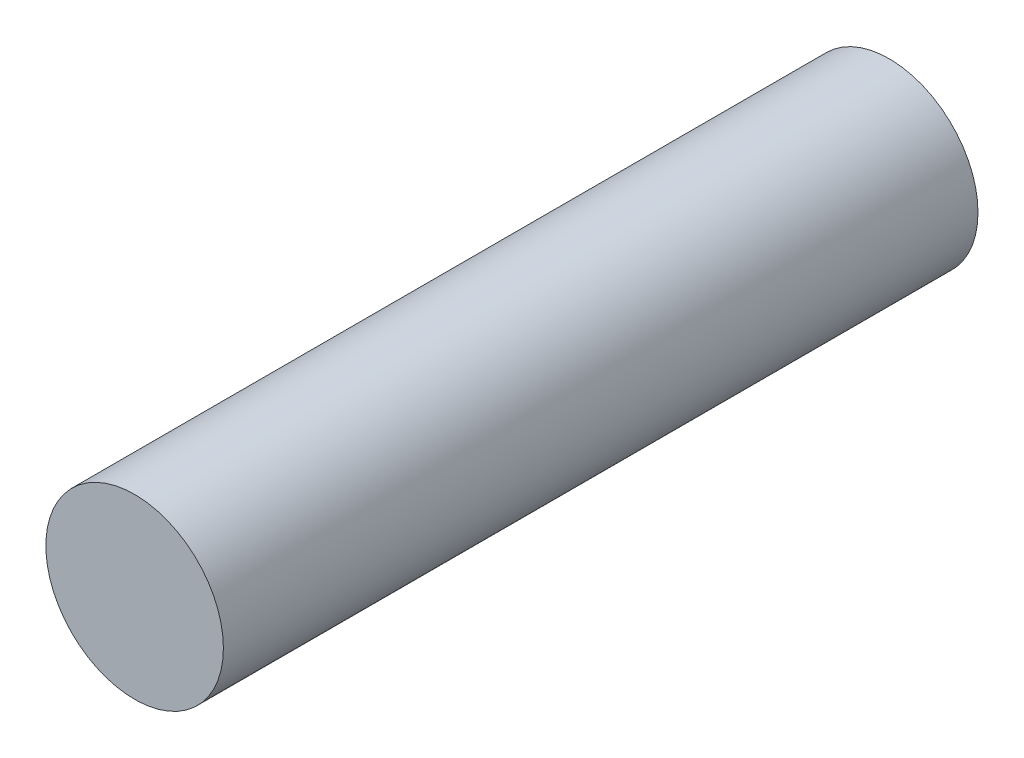
ISO-10303-21;
HEADER;
FILE_DESCRIPTION(('STEP AP214'),'2;1');
FILE_NAME('part.step','',(''),(''),'','','');
FILE_SCHEMA(('AUTOMOTIVE_DESIGN { 1 0 10303 214 1 1 1 1 }'));
ENDSEC;
DATA;
#1=APPLICATION_CONTEXT('core data for automotive mechanical design processes');
#2=APPLICATION_PROTOCOL_DEFINITION('international standard','automotive_design',2000,#1);
#3=PRODUCT_CONTEXT('',#1,'mechanical');
#4=PRODUCT('Part','Part','',(#3));
#5=PRODUCT_RELATED_PRODUCT_CATEGORY('part','',(#4));
#6=PRODUCT_DEFINITION_FORMATION('','',#4);
#7=PRODUCT_DEFINITION_CONTEXT('part definition',#1,'design');
#8=PRODUCT_DEFINITION('design','',#6,#7);
#9=PRODUCT_DEFINITION_SHAPE('','',#8);
#10=(LENGTH_UNIT() NAMED_UNIT(*) SI_UNIT(.MILLI.,.METRE.));
#11=(NAMED_UNIT(*) PLANE_ANGLE_UNIT() SI_UNIT($,.RADIAN.));
#12=(NAMED_UNIT(*) SI_UNIT($,.STERADIAN.) SOLID_ANGLE_UNIT());
#13=UNCERTAINTY_MEASURE_WITH_UNIT(LENGTH_MEASURE(1.E-05),#10,'distance_accuracy_value','');
#14=(GEOMETRIC_REPRESENTATION_CONTEXT(3) GLOBAL_UNCERTAINTY_ASSIGNED_CONTEXT((#13)) GLOBAL_UNIT_ASSIGNED_CONTEXT((#10,
#11,#12)) REPRESENTATION_CONTEXT('',''));
#15=CARTESIAN_POINT('',(0.,0.,0.));
#16=DIRECTION('',(0.,0.,1.));
#17=DIRECTION('',(1.,0.,0.));
#18=AXIS2_PLACEMENT_3D('',#15,#16,#17);
#19=CARTESIAN_POINT('',(0.,0.,17.));
#20=DIRECTION('',(0.,0.,-1.));
#21=DIRECTION('',(-1.,0.,0.));
#22=AXIS2_PLACEMENT_3D('',#19,#20,#21);
#23=CYLINDRICAL_SURFACE('',#22,2.);
#24=CARTESIAN_POINT('',(0.,0.,17.));
#25=DIRECTION('',(0.,0.,1.));
#26=DIRECTION('',(1.,0.,0.));
#27=AXIS2_PLACEMENT_3D('',#24,#25,#26);
#28=CIRCLE('',#27,2.);
#29=CARTESIAN_POINT('',(2.,0.,17.));
#30=VERTEX_POINT('',#29);
#31=EDGE_CURVE('E10',#30,#30,#28,.T.);
#32=ORIENTED_EDGE('',*,*,#31,.F.);
#33=EDGE_LOOP('',(#32));
#34=FACE_BOUND('',#33,.T.);
#35=CARTESIAN_POINT('',(0.,0.,0.));
#36=DIRECTION('',(0.,0.,1.));
#37=DIRECTION('',(1.,0.,0.));
#38=AXIS2_PLACEMENT_3D('',#35,#36,#37);
#39=CIRCLE('',#38,2.);
#40=CARTESIAN_POINT('',(2.,0.,0.));
#41=VERTEX_POINT('',#40);
#42=EDGE_CURVE('E40',#41,#41,#39,.T.);
#43=ORIENTED_EDGE('',*,*,#42,.T.);
#44=EDGE_LOOP('',(#43));
#45=FACE_BOUND('',#44,.T.);
#46=ADVANCED_FACE('F37',(#34,#45),#23,.T.);
#47=CARTESIAN_POINT('',(0.,0.,17.));
#48=DIRECTION('',(0.,0.,1.));
#49=DIRECTION('',(1.,0.,0.));
#50=AXIS2_PLACEMENT_3D('',#47,#48,#49);
#51=PLANE('',#50);
#52=ORIENTED_EDGE('',*,*,#31,.T.);
#53=EDGE_LOOP('',(#52));
#54=FACE_BOUND('',#53,.T.);
#55=ADVANCED_FACE('F52',(#54),#51,.T.);
#56=CARTESIAN_POINT('',(0.,0.,0.));
#57=DIRECTION('',(0.,0.,1.));
#58=DIRECTION('',(1.,0.,0.));
#59=AXIS2_PLACEMENT_3D('',#56,#57,#58);
#60=PLANE('',#59);
#61=ORIENTED_EDGE('',*,*,#42,.F.);
#62=EDGE_LOOP('',(#61));
#63=FACE_BOUND('',#62,.T.);
#64=ADVANCED_FACE('F50',(#63),#60,.F.);
#65=CLOSED_SHELL('',(#46,#55,#64));
#66=MANIFOLD_SOLID_BREP('B2',#65);
#67=ADVANCED_BREP_SHAPE_REPRESENTATION('',(#18,#66),#14);
#68=SHAPE_DEFINITION_REPRESENTATION(#9,#67);
ENDSEC;
END-ISO-10303-21;
